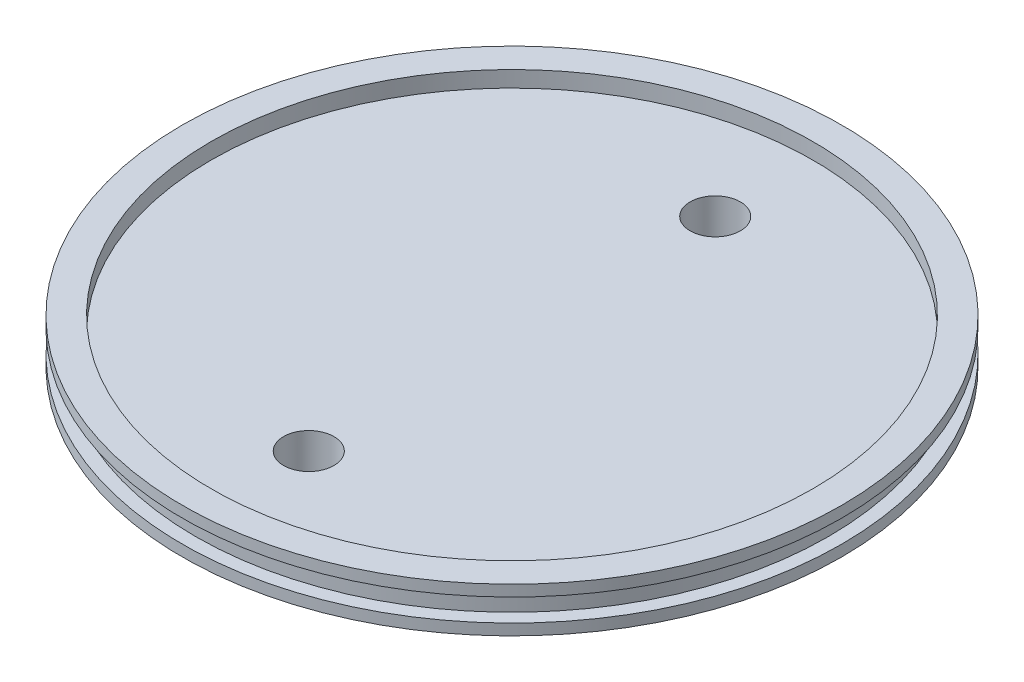
ISO-10303-21;
HEADER;
FILE_DESCRIPTION(('STEP AP214'),'2;1');
FILE_NAME('part.step','',(''),(''),'','','');
FILE_SCHEMA(('AUTOMOTIVE_DESIGN { 1 0 10303 214 1 1 1 1 }'));
ENDSEC;
DATA;
#1=APPLICATION_CONTEXT('core data for automotive mechanical design processes');
#2=APPLICATION_PROTOCOL_DEFINITION('international standard','automotive_design',2000,#1);
#3=PRODUCT_CONTEXT('',#1,'mechanical');
#4=PRODUCT('Part','Part','',(#3));
#5=PRODUCT_RELATED_PRODUCT_CATEGORY('part','',(#4));
#6=PRODUCT_DEFINITION_FORMATION('','',#4);
#7=PRODUCT_DEFINITION_CONTEXT('part definition',#1,'design');
#8=PRODUCT_DEFINITION('design','',#6,#7);
#9=PRODUCT_DEFINITION_SHAPE('','',#8);
#10=(LENGTH_UNIT() NAMED_UNIT(*) SI_UNIT(.MILLI.,.METRE.));
#11=(NAMED_UNIT(*) PLANE_ANGLE_UNIT() SI_UNIT($,.RADIAN.));
#12=(NAMED_UNIT(*) SI_UNIT($,.STERADIAN.) SOLID_ANGLE_UNIT());
#13=UNCERTAINTY_MEASURE_WITH_UNIT(LENGTH_MEASURE(1.E-05),#10,'distance_accuracy_value','');
#14=(GEOMETRIC_REPRESENTATION_CONTEXT(3) GLOBAL_UNCERTAINTY_ASSIGNED_CONTEXT((#13)) GLOBAL_UNIT_ASSIGNED_CONTEXT((#10,
#11,#12)) REPRESENTATION_CONTEXT('',''));
#15=CARTESIAN_POINT('',(0.,0.,0.));
#16=DIRECTION('',(0.,0.,1.));
#17=DIRECTION('',(1.,0.,0.));
#18=AXIS2_PLACEMENT_3D('',#15,#16,#17);
#19=CARTESIAN_POINT('',(0.,0.,0.));
#20=DIRECTION('',(0.,1.,0.));
#21=DIRECTION('',(-1.,0.,0.));
#22=AXIS2_PLACEMENT_3D('',#19,#20,#21);
#23=PLANE('',#22);
#24=CARTESIAN_POINT('',(0.,0.,0.));
#25=DIRECTION('',(0.,-1.,0.));
#26=DIRECTION('',(1.,0.,0.));
#27=AXIS2_PLACEMENT_3D('',#24,#25,#26);
#28=CIRCLE('',#27,66.04);
#29=CARTESIAN_POINT('',(66.04,0.,0.));
#30=VERTEX_POINT('',#29);
#31=EDGE_CURVE('E10',#30,#30,#28,.T.);
#32=ORIENTED_EDGE('',*,*,#31,.F.);
#33=EDGE_LOOP('',(#32));
#34=FACE_BOUND('',#33,.T.);
#35=CARTESIAN_POINT('',(0.,0.,0.));
#36=DIRECTION('',(0.,1.,0.));
#37=DIRECTION('',(-1.,0.,0.));
#38=AXIS2_PLACEMENT_3D('',#35,#36,#37);
#39=CIRCLE('',#38,72.898);
#40=CARTESIAN_POINT('',(-72.898,0.,0.));
#41=VERTEX_POINT('',#40);
#42=EDGE_CURVE('E46',#41,#41,#39,.T.);
#43=ORIENTED_EDGE('',*,*,#42,.F.);
#44=EDGE_LOOP('',(#43));
#45=FACE_BOUND('',#44,.T.);
#46=ADVANCED_FACE('F43',(#34,#45),#23,.F.);
#47=CARTESIAN_POINT('',(0.,48.1922132313012,0.));
#48=DIRECTION('',(0.,1.,0.));
#49=DIRECTION('',(-1.,0.,0.));
#50=AXIS2_PLACEMENT_3D('',#47,#48,#49);
#51=CYLINDRICAL_SURFACE('',#50,72.898);
#52=CARTESIAN_POINT('',(0.,2.4638,0.));
#53=DIRECTION('',(0.,1.,0.));
#54=DIRECTION('',(-1.,0.,0.));
#55=AXIS2_PLACEMENT_3D('',#52,#53,#54);
#56=CIRCLE('',#55,72.898);
#57=CARTESIAN_POINT('',(-72.898,2.46379999999999,0.));
#58=VERTEX_POINT('',#57);
#59=EDGE_CURVE('E56',#58,#58,#56,.T.);
#60=ORIENTED_EDGE('',*,*,#59,.F.);
#61=EDGE_LOOP('',(#60));
#62=FACE_BOUND('',#61,.T.);
#63=ORIENTED_EDGE('',*,*,#42,.T.);
#64=EDGE_LOOP('',(#63));
#65=FACE_BOUND('',#64,.T.);
#66=ADVANCED_FACE('F90',(#62,#65),#51,.T.);
#67=CARTESIAN_POINT('',(72.898,2.4638,0.));
#68=DIRECTION('',(0.,-1.,0.));
#69=DIRECTION('',(1.,0.,0.));
#70=AXIS2_PLACEMENT_3D('',#67,#68,#69);
#71=PLANE('',#70);
#72=CARTESIAN_POINT('',(0.,2.4638,0.));
#73=DIRECTION('',(0.,1.,0.));
#74=DIRECTION('',(-1.,0.,0.));
#75=AXIS2_PLACEMENT_3D('',#72,#73,#74);
#76=CIRCLE('',#75,69.977);
#77=CARTESIAN_POINT('',(-69.977,2.46379999999999,0.));
#78=VERTEX_POINT('',#77);
#79=EDGE_CURVE('E81',#78,#78,#76,.T.);
#80=ORIENTED_EDGE('',*,*,#79,.F.);
#81=EDGE_LOOP('',(#80));
#82=FACE_BOUND('',#81,.T.);
#83=ORIENTED_EDGE('',*,*,#59,.T.);
#84=EDGE_LOOP('',(#83));
#85=FACE_BOUND('',#84,.T.);
#86=ADVANCED_FACE('F88',(#82,#85),#71,.F.);
#87=CARTESIAN_POINT('',(0.,48.1922132313012,0.));
#88=DIRECTION('',(0.,1.,0.));
#89=DIRECTION('',(-1.,0.,0.));
#90=AXIS2_PLACEMENT_3D('',#87,#88,#89);
#91=CYLINDRICAL_SURFACE('',#90,69.977);
#92=CARTESIAN_POINT('',(0.,7.44219999999999,0.));
#93=DIRECTION('',(0.,1.,0.));
#94=DIRECTION('',(-1.,0.,0.));
#95=AXIS2_PLACEMENT_3D('',#92,#93,#94);
#96=CIRCLE('',#95,69.977);
#97=CARTESIAN_POINT('',(-69.977,7.44219999999998,0.));
#98=VERTEX_POINT('',#97);
#99=EDGE_CURVE('E77',#98,#98,#96,.T.);
#100=ORIENTED_EDGE('',*,*,#99,.F.);
#101=EDGE_LOOP('',(#100));
#102=FACE_BOUND('',#101,.T.);
#103=ORIENTED_EDGE('',*,*,#79,.T.);
#104=EDGE_LOOP('',(#103));
#105=FACE_BOUND('',#104,.T.);
#106=ADVANCED_FACE('F187',(#102,#105),#91,.T.);
#107=CARTESIAN_POINT('',(69.977,7.4422,0.));
#108=DIRECTION('',(0.,1.,0.));
#109=DIRECTION('',(-1.,0.,0.));
#110=AXIS2_PLACEMENT_3D('',#107,#108,#109);
#111=PLANE('',#110);
#112=CARTESIAN_POINT('',(0.,7.44219999999999,0.));
#113=DIRECTION('',(0.,1.,0.));
#114=DIRECTION('',(-1.,0.,0.));
#115=AXIS2_PLACEMENT_3D('',#112,#113,#114);
#116=CIRCLE('',#115,72.898);
#117=CARTESIAN_POINT('',(-72.898,7.44219999999998,0.));
#118=VERTEX_POINT('',#117);
#119=EDGE_CURVE('E73',#118,#118,#116,.T.);
#120=ORIENTED_EDGE('',*,*,#119,.F.);
#121=EDGE_LOOP('',(#120));
#122=FACE_BOUND('',#121,.T.);
#123=ORIENTED_EDGE('',*,*,#99,.T.);
#124=EDGE_LOOP('',(#123));
#125=FACE_BOUND('',#124,.T.);
#126=ADVANCED_FACE('F178',(#122,#125),#111,.F.);
#127=CARTESIAN_POINT('',(0.,48.1922132313012,0.));
#128=DIRECTION('',(0.,1.,0.));
#129=DIRECTION('',(-1.,0.,0.));
#130=AXIS2_PLACEMENT_3D('',#127,#128,#129);
#131=CYLINDRICAL_SURFACE('',#130,72.898);
#132=CARTESIAN_POINT('',(0.,9.90599999999999,0.));
#133=DIRECTION('',(0.,1.,0.));
#134=DIRECTION('',(-1.,0.,0.));
#135=AXIS2_PLACEMENT_3D('',#132,#133,#134);
#136=CIRCLE('',#135,72.898);
#137=CARTESIAN_POINT('',(-72.898,9.90599999999998,0.));
#138=VERTEX_POINT('',#137);
#139=EDGE_CURVE('E69',#138,#138,#136,.T.);
#140=ORIENTED_EDGE('',*,*,#139,.F.);
#141=EDGE_LOOP('',(#140));
#142=FACE_BOUND('',#141,.T.);
#143=ORIENTED_EDGE('',*,*,#119,.T.);
#144=EDGE_LOOP('',(#143));
#145=FACE_BOUND('',#144,.T.);
#146=ADVANCED_FACE('F169',(#142,#145),#131,.T.);
#147=CARTESIAN_POINT('',(72.898,9.906,0.));
#148=DIRECTION('',(0.,-1.,0.));
#149=DIRECTION('',(1.,0.,0.));
#150=AXIS2_PLACEMENT_3D('',#147,#148,#149);
#151=PLANE('',#150);
#152=CARTESIAN_POINT('',(0.,9.90599999999999,0.));
#153=DIRECTION('',(0.,1.,0.));
#154=DIRECTION('',(-1.,0.,0.));
#155=AXIS2_PLACEMENT_3D('',#152,#153,#154);
#156=CIRCLE('',#155,66.548);
#157=CARTESIAN_POINT('',(-66.548,9.90599999999998,0.));
#158=VERTEX_POINT('',#157);
#159=EDGE_CURVE('E65',#158,#158,#156,.T.);
#160=ORIENTED_EDGE('',*,*,#159,.F.);
#161=EDGE_LOOP('',(#160));
#162=FACE_BOUND('',#161,.T.);
#163=ORIENTED_EDGE('',*,*,#139,.T.);
#164=EDGE_LOOP('',(#163));
#165=FACE_BOUND('',#164,.T.);
#166=ADVANCED_FACE('F161',(#162,#165),#151,.F.);
#167=CARTESIAN_POINT('',(0.,48.1922132313012,0.));
#168=DIRECTION('',(0.,1.,0.));
#169=DIRECTION('',(-1.,0.,0.));
#170=AXIS2_PLACEMENT_3D('',#167,#168,#169);
#171=CYLINDRICAL_SURFACE('',#170,66.548);
#172=CARTESIAN_POINT('',(0.,6.34999999999999,0.));
#173=DIRECTION('',(0.,1.,0.));
#174=DIRECTION('',(-1.,0.,0.));
#175=AXIS2_PLACEMENT_3D('',#172,#173,#174);
#176=CIRCLE('',#175,66.548);
#177=CARTESIAN_POINT('',(-66.548,6.34999999999999,0.));
#178=VERTEX_POINT('',#177);
#179=EDGE_CURVE('E61',#178,#178,#176,.T.);
#180=ORIENTED_EDGE('',*,*,#179,.F.);
#181=EDGE_LOOP('',(#180));
#182=FACE_BOUND('',#181,.T.);
#183=ORIENTED_EDGE('',*,*,#159,.T.);
#184=EDGE_LOOP('',(#183));
#185=FACE_BOUND('',#184,.T.);
#186=ADVANCED_FACE('F105',(#182,#185),#171,.F.);
#187=CARTESIAN_POINT('',(66.548,6.35,0.));
#188=DIRECTION('',(0.,-1.,0.));
#189=DIRECTION('',(1.,0.,0.));
#190=AXIS2_PLACEMENT_3D('',#187,#188,#189);
#191=PLANE('',#190);
#192=CARTESIAN_POINT('',(0.,6.34999999999999,44.958));
#193=DIRECTION('',(0.,-1.,0.));
#194=DIRECTION('',(1.,0.,0.));
#195=AXIS2_PLACEMENT_3D('',#192,#193,#194);
#196=CIRCLE('',#195,5.56259999999999);
#197=CARTESIAN_POINT('',(5.56259999999999,6.35,44.958));
#198=VERTEX_POINT('',#197);
#199=EDGE_CURVE('E236',#198,#198,#196,.T.);
#200=ORIENTED_EDGE('',*,*,#199,.T.);
#201=EDGE_LOOP('',(#200));
#202=FACE_BOUND('',#201,.T.);
#203=CARTESIAN_POINT('',(0.,6.34999999999999,-44.958));
#204=DIRECTION('',(0.,-1.,0.));
#205=DIRECTION('',(1.,0.,0.));
#206=AXIS2_PLACEMENT_3D('',#203,#204,#205);
#207=CIRCLE('',#206,5.56259999999999);
#208=CARTESIAN_POINT('',(5.56259999999999,6.35,-44.958));
#209=VERTEX_POINT('',#208);
#210=EDGE_CURVE('E243',#209,#209,#207,.T.);
#211=ORIENTED_EDGE('',*,*,#210,.T.);
#212=EDGE_LOOP('',(#211));
#213=FACE_BOUND('',#212,.T.);
#214=ORIENTED_EDGE('',*,*,#179,.T.);
#215=EDGE_LOOP('',(#214));
#216=FACE_BOUND('',#215,.T.);
#217=ADVANCED_FACE('F114',(#202,#213,#216),#191,.F.);
#218=CARTESIAN_POINT('',(0.,-2.54,0.));
#219=DIRECTION('',(0.,1.,0.));
#220=DIRECTION('',(-1.,0.,0.));
#221=AXIS2_PLACEMENT_3D('',#218,#219,#220);
#222=CYLINDRICAL_SURFACE('',#221,66.04);
#223=CARTESIAN_POINT('',(0.,-2.54,0.));
#224=DIRECTION('',(0.,-1.,0.));
#225=DIRECTION('',(1.,0.,0.));
#226=AXIS2_PLACEMENT_3D('',#223,#224,#225);
#227=CIRCLE('',#226,66.04);
#228=CARTESIAN_POINT('',(66.04,-2.53999999999999,0.));
#229=VERTEX_POINT('',#228);
#230=EDGE_CURVE('E59',#229,#229,#227,.T.);
#231=ORIENTED_EDGE('',*,*,#230,.F.);
#232=EDGE_LOOP('',(#231));
#233=FACE_BOUND('',#232,.T.);
#234=ORIENTED_EDGE('',*,*,#31,.T.);
#235=EDGE_LOOP('',(#234));
#236=FACE_BOUND('',#235,.T.);
#237=ADVANCED_FACE('F109',(#233,#236),#222,.T.);
#238=CARTESIAN_POINT('',(0.,-2.54,0.));
#239=DIRECTION('',(0.,-1.,0.));
#240=DIRECTION('',(1.,0.,0.));
#241=AXIS2_PLACEMENT_3D('',#238,#239,#240);
#242=PLANE('',#241);
#243=CARTESIAN_POINT('',(0.,-2.54,44.958));
#244=DIRECTION('',(0.,-1.,0.));
#245=DIRECTION('',(0.,0.,-1.));
#246=AXIS2_PLACEMENT_3D('',#243,#244,#245);
#247=CIRCLE('',#246,5.56259999999999);
#248=CARTESIAN_POINT('',(0.,-2.54,39.3954));
#249=VERTEX_POINT('',#248);
#250=EDGE_CURVE('E233',#249,#249,#247,.T.);
#251=ORIENTED_EDGE('',*,*,#250,.F.);
#252=EDGE_LOOP('',(#251));
#253=FACE_BOUND('',#252,.T.);
#254=CARTESIAN_POINT('',(0.,-2.54,-44.958));
#255=DIRECTION('',(0.,-1.,0.));
#256=DIRECTION('',(0.,0.,-1.));
#257=AXIS2_PLACEMENT_3D('',#254,#255,#256);
#258=CIRCLE('',#257,5.56259999999999);
#259=CARTESIAN_POINT('',(0.,-2.54,-50.5206));
#260=VERTEX_POINT('',#259);
#261=EDGE_CURVE('E238',#260,#260,#258,.T.);
#262=ORIENTED_EDGE('',*,*,#261,.F.);
#263=EDGE_LOOP('',(#262));
#264=FACE_BOUND('',#263,.T.);
#265=ORIENTED_EDGE('',*,*,#230,.T.);
#266=EDGE_LOOP('',(#265));
#267=FACE_BOUND('',#266,.T.);
#268=ADVANCED_FACE('F113',(#253,#264,#267),#242,.T.);
#269=CARTESIAN_POINT('',(0.,-2.54,-44.958));
#270=DIRECTION('',(0.,-1.,0.));
#271=DIRECTION('',(0.,0.,-1.));
#272=AXIS2_PLACEMENT_3D('',#269,#270,#271);
#273=CYLINDRICAL_SURFACE('',#272,5.56259999999999);
#274=ORIENTED_EDGE('',*,*,#261,.T.);
#275=EDGE_LOOP('',(#274));
#276=FACE_BOUND('',#275,.T.);
#277=ORIENTED_EDGE('',*,*,#210,.F.);
#278=EDGE_LOOP('',(#277));
#279=FACE_BOUND('',#278,.T.);
#280=ADVANCED_FACE('F122',(#276,#279),#273,.F.);
#281=CARTESIAN_POINT('',(0.,-2.54,44.958));
#282=DIRECTION('',(0.,-1.,0.));
#283=DIRECTION('',(0.,0.,-1.));
#284=AXIS2_PLACEMENT_3D('',#281,#282,#283);
#285=CYLINDRICAL_SURFACE('',#284,5.56259999999999);
#286=ORIENTED_EDGE('',*,*,#250,.T.);
#287=EDGE_LOOP('',(#286));
#288=FACE_BOUND('',#287,.T.);
#289=ORIENTED_EDGE('',*,*,#199,.F.);
#290=EDGE_LOOP('',(#289));
#291=FACE_BOUND('',#290,.T.);
#292=ADVANCED_FACE('F126',(#288,#291),#285,.F.);
#293=CLOSED_SHELL('',(#46,#66,#86,#106,#126,#146,#166,#186,#217,#237,#268,#280,#292));
#294=MANIFOLD_SOLID_BREP('B2',#293);
#295=ADVANCED_BREP_SHAPE_REPRESENTATION('',(#18,#294),#14);
#296=SHAPE_DEFINITION_REPRESENTATION(#9,#295);
ENDSEC;
END-ISO-10303-21;
